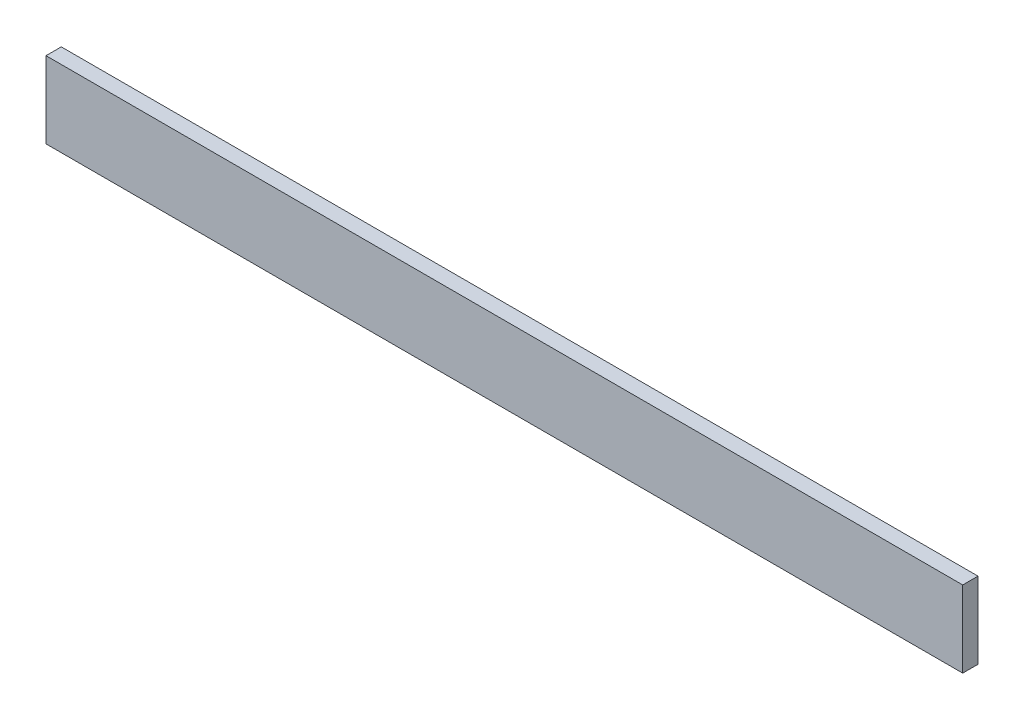
ISO-10303-21;
HEADER;
FILE_DESCRIPTION(('STEP AP214'),'2;1');
FILE_NAME('part.step','',(''),(''),'','','');
FILE_SCHEMA(('AUTOMOTIVE_DESIGN { 1 0 10303 214 1 1 1 1 }'));
ENDSEC;
DATA;
#1=APPLICATION_CONTEXT('core data for automotive mechanical design processes');
#2=APPLICATION_PROTOCOL_DEFINITION('international standard','automotive_design',2000,#1);
#3=PRODUCT_CONTEXT('',#1,'mechanical');
#4=PRODUCT('Part','Part','',(#3));
#5=PRODUCT_RELATED_PRODUCT_CATEGORY('part','',(#4));
#6=PRODUCT_DEFINITION_FORMATION('','',#4);
#7=PRODUCT_DEFINITION_CONTEXT('part definition',#1,'design');
#8=PRODUCT_DEFINITION('design','',#6,#7);
#9=PRODUCT_DEFINITION_SHAPE('','',#8);
#10=(LENGTH_UNIT() NAMED_UNIT(*) SI_UNIT(.MILLI.,.METRE.));
#11=(NAMED_UNIT(*) PLANE_ANGLE_UNIT() SI_UNIT($,.RADIAN.));
#12=(NAMED_UNIT(*) SI_UNIT($,.STERADIAN.) SOLID_ANGLE_UNIT());
#13=UNCERTAINTY_MEASURE_WITH_UNIT(LENGTH_MEASURE(1.E-05),#10,'distance_accuracy_value','');
#14=(GEOMETRIC_REPRESENTATION_CONTEXT(3) GLOBAL_UNCERTAINTY_ASSIGNED_CONTEXT((#13)) GLOBAL_UNIT_ASSIGNED_CONTEXT((#10,
#11,#12)) REPRESENTATION_CONTEXT('',''));
#15=CARTESIAN_POINT('',(0.,0.,0.));
#16=DIRECTION('',(0.,0.,1.));
#17=DIRECTION('',(1.,0.,0.));
#18=AXIS2_PLACEMENT_3D('',#15,#16,#17);
#19=CARTESIAN_POINT('',(0.,0.,3.));
#20=DIRECTION('',(-1.,0.,0.));
#21=DIRECTION('',(0.,0.,1.));
#22=AXIS2_PLACEMENT_3D('',#19,#20,#21);
#23=PLANE('',#22);
#24=DIRECTION('',(0.,1.,0.));
#25=VECTOR('',#24,1.);
#26=CARTESIAN_POINT('',(0.,0.,0.));
#27=LINE('',#26,#25);
#28=CARTESIAN_POINT('',(0.,0.,0.));
#29=VERTEX_POINT('',#28);
#30=CARTESIAN_POINT('',(0.,15.,0.));
#31=VERTEX_POINT('',#30);
#32=EDGE_CURVE('E99',#29,#31,#27,.T.);
#33=ORIENTED_EDGE('',*,*,#32,.T.);
#34=DIRECTION('',(0.,0.,-1.));
#35=VECTOR('',#34,1.);
#36=CARTESIAN_POINT('',(0.,15.,3.));
#37=LINE('',#36,#35);
#38=CARTESIAN_POINT('',(0.,15.,3.));
#39=VERTEX_POINT('',#38);
#40=EDGE_CURVE('E11',#39,#31,#37,.T.);
#41=ORIENTED_EDGE('',*,*,#40,.F.);
#42=DIRECTION('',(0.,1.,0.));
#43=VECTOR('',#42,1.);
#44=CARTESIAN_POINT('',(0.,0.,3.));
#45=LINE('',#44,#43);
#46=CARTESIAN_POINT('',(0.,0.,3.));
#47=VERTEX_POINT('',#46);
#48=EDGE_CURVE('E87',#47,#39,#45,.T.);
#49=ORIENTED_EDGE('',*,*,#48,.F.);
#50=DIRECTION('',(0.,0.,-1.));
#51=VECTOR('',#50,1.);
#52=CARTESIAN_POINT('',(0.,0.,3.));
#53=LINE('',#52,#51);
#54=EDGE_CURVE('E95',#47,#29,#53,.T.);
#55=ORIENTED_EDGE('',*,*,#54,.T.);
#56=EDGE_LOOP('',(#33,#41,#49,#55));
#57=FACE_BOUND('',#56,.T.);
#58=ADVANCED_FACE('F36',(#57),#23,.F.);
#59=CARTESIAN_POINT('',(0.,15.,3.));
#60=DIRECTION('',(0.,-1.,0.));
#61=DIRECTION('',(1.,0.,0.));
#62=AXIS2_PLACEMENT_3D('',#59,#60,#61);
#63=PLANE('',#62);
#64=DIRECTION('',(-1.,0.,0.));
#65=VECTOR('',#64,1.);
#66=CARTESIAN_POINT('',(0.,15.,0.));
#67=LINE('',#66,#65);
#68=CARTESIAN_POINT('',(-180.,15.,0.));
#69=VERTEX_POINT('',#68);
#70=EDGE_CURVE('E91',#31,#69,#67,.T.);
#71=ORIENTED_EDGE('',*,*,#70,.T.);
#72=DIRECTION('',(0.,0.,-1.));
#73=VECTOR('',#72,1.);
#74=CARTESIAN_POINT('',(-180.,15.,3.));
#75=LINE('',#74,#73);
#76=CARTESIAN_POINT('',(-180.,15.,3.));
#77=VERTEX_POINT('',#76);
#78=EDGE_CURVE('E44',#77,#69,#75,.T.);
#79=ORIENTED_EDGE('',*,*,#78,.F.);
#80=DIRECTION('',(-1.,0.,0.));
#81=VECTOR('',#80,1.);
#82=CARTESIAN_POINT('',(0.,15.,3.));
#83=LINE('',#82,#81);
#84=EDGE_CURVE('E82',#39,#77,#83,.T.);
#85=ORIENTED_EDGE('',*,*,#84,.F.);
#86=ORIENTED_EDGE('',*,*,#40,.T.);
#87=EDGE_LOOP('',(#71,#79,#85,#86));
#88=FACE_BOUND('',#87,.T.);
#89=ADVANCED_FACE('F90',(#88),#63,.F.);
#90=CARTESIAN_POINT('',(-180.,0.,3.));
#91=DIRECTION('',(1.,0.,0.));
#92=DIRECTION('',(0.,0.,-1.));
#93=AXIS2_PLACEMENT_3D('',#90,#91,#92);
#94=PLANE('',#93);
#95=DIRECTION('',(0.,-1.,0.));
#96=VECTOR('',#95,1.);
#97=CARTESIAN_POINT('',(-180.,0.,0.));
#98=LINE('',#97,#96);
#99=CARTESIAN_POINT('',(-180.,0.,0.));
#100=VERTEX_POINT('',#99);
#101=EDGE_CURVE('E69',#69,#100,#98,.T.);
#102=ORIENTED_EDGE('',*,*,#101,.T.);
#103=DIRECTION('',(0.,0.,-1.));
#104=VECTOR('',#103,1.);
#105=CARTESIAN_POINT('',(-180.,0.,3.));
#106=LINE('',#105,#104);
#107=CARTESIAN_POINT('',(-180.,0.,3.));
#108=VERTEX_POINT('',#107);
#109=EDGE_CURVE('E92',#108,#100,#106,.T.);
#110=ORIENTED_EDGE('',*,*,#109,.F.);
#111=DIRECTION('',(0.,-1.,0.));
#112=VECTOR('',#111,1.);
#113=CARTESIAN_POINT('',(-180.,0.,3.));
#114=LINE('',#113,#112);
#115=EDGE_CURVE('E85',#77,#108,#114,.T.);
#116=ORIENTED_EDGE('',*,*,#115,.F.);
#117=ORIENTED_EDGE('',*,*,#78,.T.);
#118=EDGE_LOOP('',(#102,#110,#116,#117));
#119=FACE_BOUND('',#118,.T.);
#120=ADVANCED_FACE('F93',(#119),#94,.F.);
#121=CARTESIAN_POINT('',(0.,0.,3.));
#122=DIRECTION('',(0.,1.,0.));
#123=DIRECTION('',(-1.,0.,0.));
#124=AXIS2_PLACEMENT_3D('',#121,#122,#123);
#125=PLANE('',#124);
#126=DIRECTION('',(1.,0.,0.));
#127=VECTOR('',#126,1.);
#128=CARTESIAN_POINT('',(0.,0.,0.));
#129=LINE('',#128,#127);
#130=EDGE_CURVE('E75',#100,#29,#129,.T.);
#131=ORIENTED_EDGE('',*,*,#130,.T.);
#132=ORIENTED_EDGE('',*,*,#54,.F.);
#133=DIRECTION('',(1.,0.,0.));
#134=VECTOR('',#133,1.);
#135=CARTESIAN_POINT('',(0.,0.,3.));
#136=LINE('',#135,#134);
#137=EDGE_CURVE('E52',#108,#47,#136,.T.);
#138=ORIENTED_EDGE('',*,*,#137,.F.);
#139=ORIENTED_EDGE('',*,*,#109,.T.);
#140=EDGE_LOOP('',(#131,#132,#138,#139));
#141=FACE_BOUND('',#140,.T.);
#142=ADVANCED_FACE('F106',(#141),#125,.F.);
#143=CARTESIAN_POINT('',(0.,0.,3.));
#144=DIRECTION('',(0.,0.,1.));
#145=DIRECTION('',(1.,0.,0.));
#146=AXIS2_PLACEMENT_3D('',#143,#144,#145);
#147=PLANE('',#146);
#148=ORIENTED_EDGE('',*,*,#48,.T.);
#149=ORIENTED_EDGE('',*,*,#84,.T.);
#150=ORIENTED_EDGE('',*,*,#115,.T.);
#151=ORIENTED_EDGE('',*,*,#137,.T.);
#152=EDGE_LOOP('',(#148,#149,#150,#151));
#153=FACE_BOUND('',#152,.T.);
#154=ADVANCED_FACE('F83',(#153),#147,.T.);
#155=CARTESIAN_POINT('',(0.,0.,0.));
#156=DIRECTION('',(0.,0.,1.));
#157=DIRECTION('',(1.,0.,0.));
#158=AXIS2_PLACEMENT_3D('',#155,#156,#157);
#159=PLANE('',#158);
#160=ORIENTED_EDGE('',*,*,#32,.F.);
#161=ORIENTED_EDGE('',*,*,#130,.F.);
#162=ORIENTED_EDGE('',*,*,#101,.F.);
#163=ORIENTED_EDGE('',*,*,#70,.F.);
#164=EDGE_LOOP('',(#160,#161,#162,#163));
#165=FACE_BOUND('',#164,.T.);
#166=ADVANCED_FACE('F109',(#165),#159,.F.);
#167=CLOSED_SHELL('',(#58,#89,#120,#142,#154,#166));
#168=MANIFOLD_SOLID_BREP('B2',#167);
#169=ADVANCED_BREP_SHAPE_REPRESENTATION('',(#18,#168),#14);
#170=SHAPE_DEFINITION_REPRESENTATION(#9,#169);
ENDSEC;
END-ISO-10303-21;
